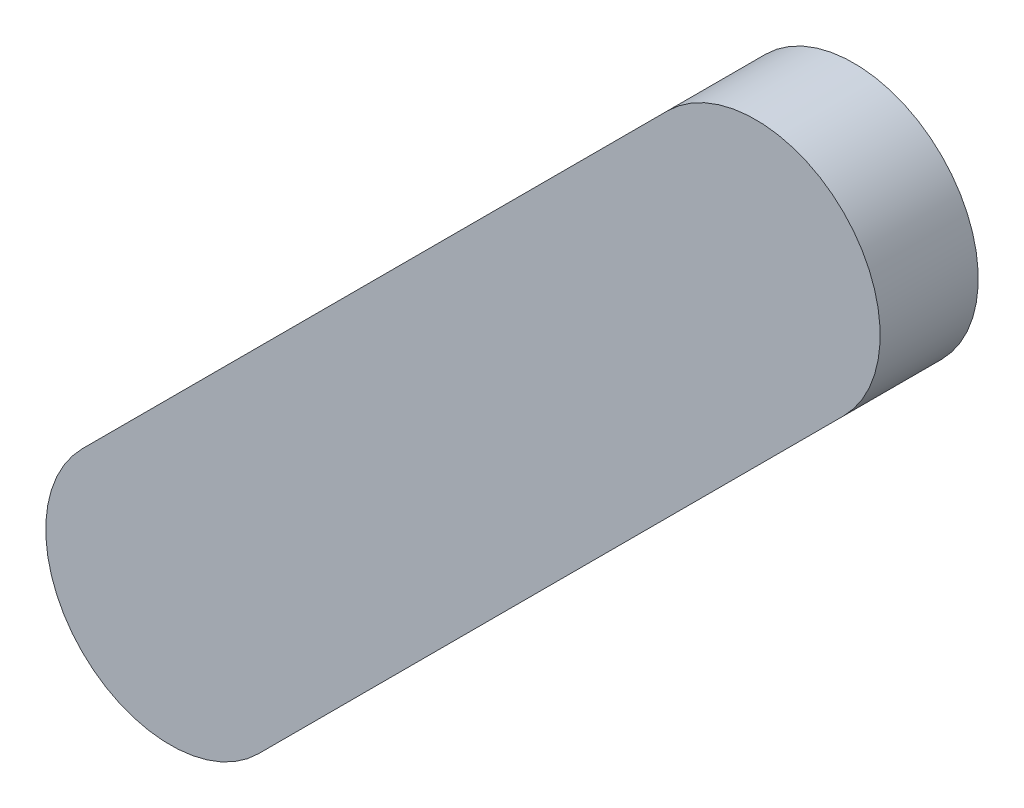
ISO-10303-21;
HEADER;
FILE_DESCRIPTION(('STEP AP214'),'2;1');
FILE_NAME('part.step','',(''),(''),'','','');
FILE_SCHEMA(('AUTOMOTIVE_DESIGN { 1 0 10303 214 1 1 1 1 }'));
ENDSEC;
DATA;
#1=APPLICATION_CONTEXT('core data for automotive mechanical design processes');
#2=APPLICATION_PROTOCOL_DEFINITION('international standard','automotive_design',2000,#1);
#3=PRODUCT_CONTEXT('',#1,'mechanical');
#4=PRODUCT('Part','Part','',(#3));
#5=PRODUCT_RELATED_PRODUCT_CATEGORY('part','',(#4));
#6=PRODUCT_DEFINITION_FORMATION('','',#4);
#7=PRODUCT_DEFINITION_CONTEXT('part definition',#1,'design');
#8=PRODUCT_DEFINITION('design','',#6,#7);
#9=PRODUCT_DEFINITION_SHAPE('','',#8);
#10=(LENGTH_UNIT() NAMED_UNIT(*) SI_UNIT(.MILLI.,.METRE.));
#11=(NAMED_UNIT(*) PLANE_ANGLE_UNIT() SI_UNIT($,.RADIAN.));
#12=(NAMED_UNIT(*) SI_UNIT($,.STERADIAN.) SOLID_ANGLE_UNIT());
#13=UNCERTAINTY_MEASURE_WITH_UNIT(LENGTH_MEASURE(1.E-05),#10,'distance_accuracy_value','');
#14=(GEOMETRIC_REPRESENTATION_CONTEXT(3) GLOBAL_UNCERTAINTY_ASSIGNED_CONTEXT((#13)) GLOBAL_UNIT_ASSIGNED_CONTEXT((#10,
#11,#12)) REPRESENTATION_CONTEXT('',''));
#15=CARTESIAN_POINT('',(0.,0.,0.));
#16=DIRECTION('',(0.,0.,1.));
#17=DIRECTION('',(1.,0.,0.));
#18=AXIS2_PLACEMENT_3D('',#15,#16,#17);
#19=CARTESIAN_POINT('',(109.14560594,118.89559406,0.));
#20=DIRECTION('',(-0.707106781186552,0.707106781186543,0.));
#21=DIRECTION('',(0.707106781186543,0.707106781186552,0.));
#22=AXIS2_PLACEMENT_3D('',#19,#20,#21);
#23=PLANE('',#22);
#24=DIRECTION('',(0.707106781186543,0.707106781186552,0.));
#25=VECTOR('',#24,1.);
#26=CARTESIAN_POINT('',(109.14560594,118.89559406,0.1999996));
#27=LINE('',#26,#25);
#28=CARTESIAN_POINT('',(109.14560594,118.89559406,0.1999996));
#29=VERTEX_POINT('',#28);
#30=CARTESIAN_POINT('',(110.33940594,120.08939406,0.1999996));
#31=VERTEX_POINT('',#30);
#32=EDGE_CURVE('E11',#29,#31,#27,.T.);
#33=ORIENTED_EDGE('',*,*,#32,.F.);
#34=DIRECTION('',(0.,0.,1.));
#35=VECTOR('',#34,1.);
#36=CARTESIAN_POINT('',(109.14560594,118.89559406,0.));
#37=LINE('',#36,#35);
#38=CARTESIAN_POINT('',(109.14560594,118.89559406,0.));
#39=VERTEX_POINT('',#38);
#40=EDGE_CURVE('E24',#39,#29,#37,.T.);
#41=ORIENTED_EDGE('',*,*,#40,.F.);
#42=DIRECTION('',(0.707106781186543,0.707106781186552,0.));
#43=VECTOR('',#42,1.);
#44=CARTESIAN_POINT('',(109.14560594,118.89559406,0.));
#45=LINE('',#44,#43);
#46=CARTESIAN_POINT('',(110.33940594,120.08939406,0.));
#47=VERTEX_POINT('',#46);
#48=EDGE_CURVE('E75',#39,#47,#45,.T.);
#49=ORIENTED_EDGE('',*,*,#48,.T.);
#50=DIRECTION('',(0.,0.,1.));
#51=VECTOR('',#50,1.);
#52=CARTESIAN_POINT('',(110.33940594,120.08939406,0.));
#53=LINE('',#52,#51);
#54=EDGE_CURVE('E37',#47,#31,#53,.T.);
#55=ORIENTED_EDGE('',*,*,#54,.T.);
#56=EDGE_LOOP('',(#33,#41,#49,#55));
#57=FACE_BOUND('',#56,.T.);
#58=ADVANCED_FACE('F17',(#57),#23,.F.);
#59=CARTESIAN_POINT('',(110.1598,120.269,0.));
#60=DIRECTION('',(0.,0.,-1.));
#61=DIRECTION('',(0.707106781186548,-0.707106781186548,0.));
#62=AXIS2_PLACEMENT_3D('',#59,#60,#61);
#63=CYLINDRICAL_SURFACE('',#62,0.254001156230771);
#64=CARTESIAN_POINT('',(110.1598,120.269,0.1999996));
#65=DIRECTION('',(0.,0.,1.));
#66=DIRECTION('',(0.707106781186548,-0.707106781186548,0.));
#67=AXIS2_PLACEMENT_3D('',#64,#65,#66);
#68=CIRCLE('',#67,0.254001156230771);
#69=CARTESIAN_POINT('',(109.98019406,120.44860594,0.1999996));
#70=VERTEX_POINT('',#69);
#71=EDGE_CURVE('E83',#31,#70,#68,.T.);
#72=ORIENTED_EDGE('',*,*,#71,.F.);
#73=ORIENTED_EDGE('',*,*,#54,.F.);
#74=CARTESIAN_POINT('',(110.1598,120.269,0.));
#75=DIRECTION('',(0.,0.,1.));
#76=DIRECTION('',(0.707106781186548,-0.707106781186548,0.));
#77=AXIS2_PLACEMENT_3D('',#74,#75,#76);
#78=CIRCLE('',#77,0.254001156230771);
#79=CARTESIAN_POINT('',(109.98019406,120.44860594,0.));
#80=VERTEX_POINT('',#79);
#81=EDGE_CURVE('E81',#47,#80,#78,.T.);
#82=ORIENTED_EDGE('',*,*,#81,.T.);
#83=DIRECTION('',(0.,0.,1.));
#84=VECTOR('',#83,1.);
#85=CARTESIAN_POINT('',(109.98019406,120.44860594,0.));
#86=LINE('',#85,#84);
#87=EDGE_CURVE('E67',#80,#70,#86,.T.);
#88=ORIENTED_EDGE('',*,*,#87,.T.);
#89=EDGE_LOOP('',(#72,#73,#82,#88));
#90=FACE_BOUND('',#89,.T.);
#91=ADVANCED_FACE('F89',(#90),#63,.T.);
#92=CARTESIAN_POINT('',(109.98019406,120.44860594,0.));
#93=DIRECTION('',(0.707106781186548,-0.707106781186548,0.));
#94=DIRECTION('',(-0.707106781186548,-0.707106781186548,0.));
#95=AXIS2_PLACEMENT_3D('',#92,#93,#94);
#96=PLANE('',#95);
#97=DIRECTION('',(-0.707106781186548,-0.707106781186548,0.));
#98=VECTOR('',#97,1.);
#99=CARTESIAN_POINT('',(109.98019406,120.44860594,0.1999996));
#100=LINE('',#99,#98);
#101=CARTESIAN_POINT('',(108.78639406,119.25480594,0.1999996));
#102=VERTEX_POINT('',#101);
#103=EDGE_CURVE('E71',#70,#102,#100,.T.);
#104=ORIENTED_EDGE('',*,*,#103,.F.);
#105=ORIENTED_EDGE('',*,*,#87,.F.);
#106=DIRECTION('',(-0.707106781186548,-0.707106781186548,0.));
#107=VECTOR('',#106,1.);
#108=CARTESIAN_POINT('',(109.98019406,120.44860594,0.));
#109=LINE('',#108,#107);
#110=CARTESIAN_POINT('',(108.78639406,119.25480594,0.));
#111=VERTEX_POINT('',#110);
#112=EDGE_CURVE('E63',#80,#111,#109,.T.);
#113=ORIENTED_EDGE('',*,*,#112,.T.);
#114=DIRECTION('',(0.,0.,1.));
#115=VECTOR('',#114,1.);
#116=CARTESIAN_POINT('',(108.78639406,119.25480594,0.));
#117=LINE('',#116,#115);
#118=EDGE_CURVE('E53',#111,#102,#117,.T.);
#119=ORIENTED_EDGE('',*,*,#118,.T.);
#120=EDGE_LOOP('',(#104,#105,#113,#119));
#121=FACE_BOUND('',#120,.T.);
#122=ADVANCED_FACE('F66',(#121),#96,.F.);
#123=CARTESIAN_POINT('',(108.966,119.0752,0.));
#124=DIRECTION('',(0.,0.,-1.));
#125=DIRECTION('',(-0.707106781186548,0.707106781186548,0.));
#126=AXIS2_PLACEMENT_3D('',#123,#124,#125);
#127=CYLINDRICAL_SURFACE('',#126,0.254001156230778);
#128=CARTESIAN_POINT('',(108.966,119.0752,0.1999996));
#129=DIRECTION('',(0.,0.,1.));
#130=DIRECTION('',(-0.707106781186548,0.707106781186548,0.));
#131=AXIS2_PLACEMENT_3D('',#128,#129,#130);
#132=CIRCLE('',#131,0.254001156230778);
#133=EDGE_CURVE('E59',#102,#29,#132,.T.);
#134=ORIENTED_EDGE('',*,*,#133,.F.);
#135=ORIENTED_EDGE('',*,*,#118,.F.);
#136=CARTESIAN_POINT('',(108.966,119.0752,0.));
#137=DIRECTION('',(0.,0.,1.));
#138=DIRECTION('',(-0.707106781186548,0.707106781186548,0.));
#139=AXIS2_PLACEMENT_3D('',#136,#137,#138);
#140=CIRCLE('',#139,0.254001156230778);
#141=EDGE_CURVE('E57',#111,#39,#140,.T.);
#142=ORIENTED_EDGE('',*,*,#141,.T.);
#143=ORIENTED_EDGE('',*,*,#40,.T.);
#144=EDGE_LOOP('',(#134,#135,#142,#143));
#145=FACE_BOUND('',#144,.T.);
#146=ADVANCED_FACE('F55',(#145),#127,.T.);
#147=CARTESIAN_POINT('',(109.14560594,118.89559406,0.));
#148=DIRECTION('',(0.,0.,-1.));
#149=DIRECTION('',(-1.,0.,0.));
#150=AXIS2_PLACEMENT_3D('',#147,#148,#149);
#151=PLANE('',#150);
#152=ORIENTED_EDGE('',*,*,#141,.F.);
#153=ORIENTED_EDGE('',*,*,#112,.F.);
#154=ORIENTED_EDGE('',*,*,#81,.F.);
#155=ORIENTED_EDGE('',*,*,#48,.F.);
#156=EDGE_LOOP('',(#152,#153,#154,#155));
#157=FACE_BOUND('',#156,.T.);
#158=ADVANCED_FACE('F74',(#157),#151,.T.);
#159=CARTESIAN_POINT('',(109.14560594,118.89559406,0.1999996));
#160=DIRECTION('',(0.,0.,-1.));
#161=DIRECTION('',(-1.,0.,0.));
#162=AXIS2_PLACEMENT_3D('',#159,#160,#161);
#163=PLANE('',#162);
#164=ORIENTED_EDGE('',*,*,#32,.T.);
#165=ORIENTED_EDGE('',*,*,#71,.T.);
#166=ORIENTED_EDGE('',*,*,#103,.T.);
#167=ORIENTED_EDGE('',*,*,#133,.T.);
#168=EDGE_LOOP('',(#164,#165,#166,#167));
#169=FACE_BOUND('',#168,.T.);
#170=ADVANCED_FACE('F91',(#169),#163,.F.);
#171=CLOSED_SHELL('',(#58,#91,#122,#146,#158,#170));
#172=MANIFOLD_SOLID_BREP('B1',#171);
#173=ADVANCED_BREP_SHAPE_REPRESENTATION('',(#18,#172),#14);
#174=SHAPE_DEFINITION_REPRESENTATION(#9,#173);
ENDSEC;
END-ISO-10303-21;
